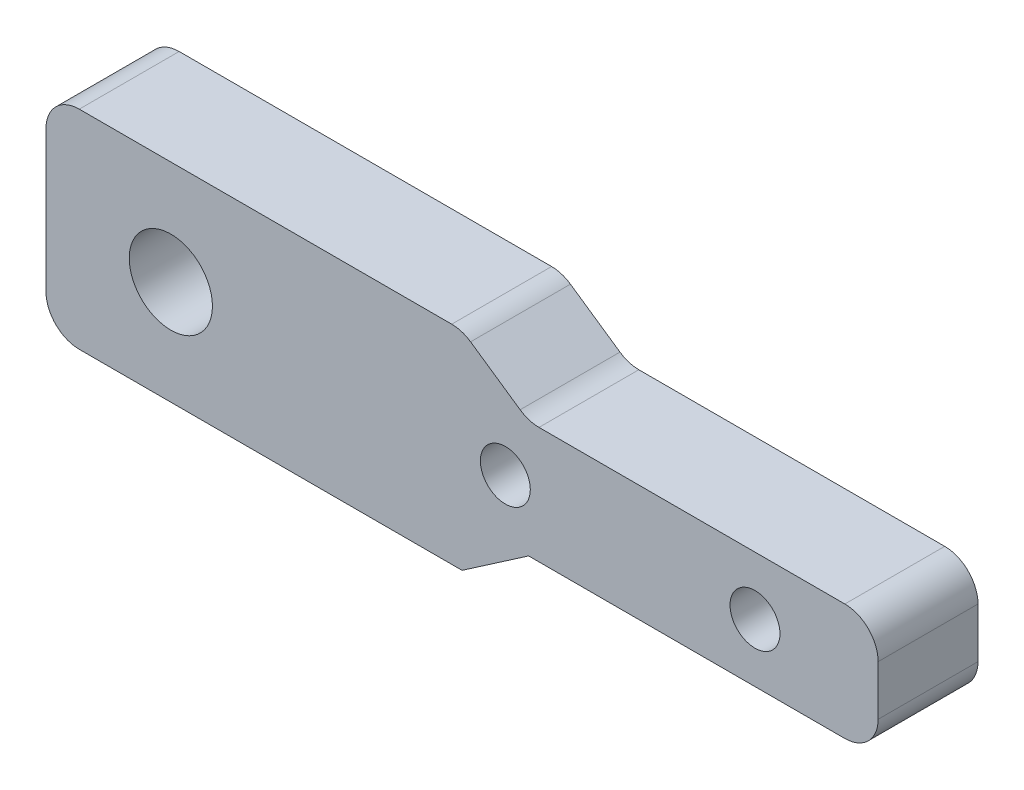
ISO-10303-21;
HEADER;
FILE_DESCRIPTION(('STEP AP214'),'2;1');
FILE_NAME('part.step','',(''),(''),'','','');
FILE_SCHEMA(('AUTOMOTIVE_DESIGN { 1 0 10303 214 1 1 1 1 }'));
ENDSEC;
DATA;
#1=APPLICATION_CONTEXT('core data for automotive mechanical design processes');
#2=APPLICATION_PROTOCOL_DEFINITION('international standard','automotive_design',2000,#1);
#3=PRODUCT_CONTEXT('',#1,'mechanical');
#4=PRODUCT('Part','Part','',(#3));
#5=PRODUCT_RELATED_PRODUCT_CATEGORY('part','',(#4));
#6=PRODUCT_DEFINITION_FORMATION('','',#4);
#7=PRODUCT_DEFINITION_CONTEXT('part definition',#1,'design');
#8=PRODUCT_DEFINITION('design','',#6,#7);
#9=PRODUCT_DEFINITION_SHAPE('','',#8);
#10=(LENGTH_UNIT() NAMED_UNIT(*) SI_UNIT(.MILLI.,.METRE.));
#11=(NAMED_UNIT(*) PLANE_ANGLE_UNIT() SI_UNIT($,.RADIAN.));
#12=(NAMED_UNIT(*) SI_UNIT($,.STERADIAN.) SOLID_ANGLE_UNIT());
#13=UNCERTAINTY_MEASURE_WITH_UNIT(LENGTH_MEASURE(1.E-05),#10,'distance_accuracy_value','');
#14=(GEOMETRIC_REPRESENTATION_CONTEXT(3) GLOBAL_UNCERTAINTY_ASSIGNED_CONTEXT((#13)) GLOBAL_UNIT_ASSIGNED_CONTEXT((#10,
#11,#12)) REPRESENTATION_CONTEXT('',''));
#15=CARTESIAN_POINT('',(0.,0.,0.));
#16=DIRECTION('',(0.,0.,1.));
#17=DIRECTION('',(1.,0.,0.));
#18=AXIS2_PLACEMENT_3D('',#15,#16,#17);
#19=CARTESIAN_POINT('',(-23.0608329047481,6.25,6.));
#20=DIRECTION('',(1.,0.,0.));
#21=DIRECTION('',(0.,0.,-1.));
#22=AXIS2_PLACEMENT_3D('',#19,#20,#21);
#23=PLANE('',#22);
#24=DIRECTION('',(0.,-1.,0.));
#25=VECTOR('',#24,1.);
#26=CARTESIAN_POINT('',(-23.0608329047481,6.25,0.));
#27=LINE('',#26,#25);
#28=CARTESIAN_POINT('',(-23.0608329047481,4.25,0.));
#29=VERTEX_POINT('',#28);
#30=CARTESIAN_POINT('',(-23.0608329047481,-4.25,0.));
#31=VERTEX_POINT('',#30);
#32=EDGE_CURVE('E176',#29,#31,#27,.T.);
#33=ORIENTED_EDGE('',*,*,#32,.T.);
#34=DIRECTION('',(0.,0.,-1.));
#35=VECTOR('',#34,1.);
#36=CARTESIAN_POINT('',(-23.0608329047481,-4.25,6.));
#37=LINE('',#36,#35);
#38=CARTESIAN_POINT('',(-23.0608329047481,-4.25,6.));
#39=VERTEX_POINT('',#38);
#40=EDGE_CURVE('E232',#31,#39,#37,.F.);
#41=ORIENTED_EDGE('',*,*,#40,.T.);
#42=DIRECTION('',(0.,-1.,0.));
#43=VECTOR('',#42,1.);
#44=CARTESIAN_POINT('',(-23.0608329047481,6.25,6.));
#45=LINE('',#44,#43);
#46=CARTESIAN_POINT('',(-23.0608329047481,4.25,6.));
#47=VERTEX_POINT('',#46);
#48=EDGE_CURVE('E146',#47,#39,#45,.T.);
#49=ORIENTED_EDGE('',*,*,#48,.F.);
#50=DIRECTION('',(0.,0.,-1.));
#51=VECTOR('',#50,1.);
#52=CARTESIAN_POINT('',(-23.0608329047481,4.25,6.));
#53=LINE('',#52,#51);
#54=EDGE_CURVE('E229',#47,#29,#53,.T.);
#55=ORIENTED_EDGE('',*,*,#54,.T.);
#56=EDGE_LOOP('',(#33,#41,#49,#55));
#57=FACE_BOUND('',#56,.T.);
#58=ADVANCED_FACE('F33',(#57),#23,.F.);
#59=CARTESIAN_POINT('',(-23.0608329047481,-6.25,6.));
#60=DIRECTION('',(0.,1.,0.));
#61=DIRECTION('',(0.,0.,1.));
#62=AXIS2_PLACEMENT_3D('',#59,#60,#61);
#63=PLANE('',#62);
#64=DIRECTION('',(1.,0.,0.));
#65=VECTOR('',#64,1.);
#66=CARTESIAN_POINT('',(-23.0608329047481,-6.25,6.));
#67=LINE('',#66,#65);
#68=CARTESIAN_POINT('',(-21.0608329047481,-6.25,6.));
#69=VERTEX_POINT('',#68);
#70=CARTESIAN_POINT('',(1.93916709525186,-6.25,6.));
#71=VERTEX_POINT('',#70);
#72=EDGE_CURVE('E133',#69,#71,#67,.T.);
#73=ORIENTED_EDGE('',*,*,#72,.F.);
#74=DIRECTION('',(0.,0.,-1.));
#75=VECTOR('',#74,1.);
#76=CARTESIAN_POINT('',(-21.0608329047481,-6.25,6.));
#77=LINE('',#76,#75);
#78=CARTESIAN_POINT('',(-21.0608329047481,-6.25,0.));
#79=VERTEX_POINT('',#78);
#80=EDGE_CURVE('E227',#69,#79,#77,.T.);
#81=ORIENTED_EDGE('',*,*,#80,.T.);
#82=DIRECTION('',(1.,0.,0.));
#83=VECTOR('',#82,1.);
#84=CARTESIAN_POINT('',(-23.0608329047481,-6.25,0.));
#85=LINE('',#84,#83);
#86=CARTESIAN_POINT('',(1.93916709525186,-6.25,0.));
#87=VERTEX_POINT('',#86);
#88=EDGE_CURVE('E152',#79,#87,#85,.T.);
#89=ORIENTED_EDGE('',*,*,#88,.T.);
#90=DIRECTION('',(0.,0.,-1.));
#91=VECTOR('',#90,1.);
#92=CARTESIAN_POINT('',(1.93916709525186,-6.25,6.));
#93=LINE('',#92,#91);
#94=EDGE_CURVE('E149',#71,#87,#93,.T.);
#95=ORIENTED_EDGE('',*,*,#94,.F.);
#96=EDGE_LOOP('',(#73,#81,#89,#95));
#97=FACE_BOUND('',#96,.T.);
#98=ADVANCED_FACE('F150',(#97),#63,.F.);
#99=CARTESIAN_POINT('',(5.93916709525186,-3.5,6.));
#100=DIRECTION('',(-0.566528822887065,0.824041924199368,0.));
#101=DIRECTION('',(-0.824041924199368,-0.566528822887065,0.));
#102=AXIS2_PLACEMENT_3D('',#99,#100,#101);
#103=PLANE('',#102);
#104=DIRECTION('',(0.824041924199368,0.566528822887065,0.));
#105=VECTOR('',#104,1.);
#106=CARTESIAN_POINT('',(5.93916709525186,-3.5,0.));
#107=LINE('',#106,#105);
#108=CARTESIAN_POINT('',(5.93916709525186,-3.5,0.));
#109=VERTEX_POINT('',#108);
#110=EDGE_CURVE('E181',#87,#109,#107,.T.);
#111=ORIENTED_EDGE('',*,*,#110,.T.);
#112=DIRECTION('',(0.,0.,-1.));
#113=VECTOR('',#112,1.);
#114=CARTESIAN_POINT('',(5.93916709525186,-3.5,6.));
#115=LINE('',#114,#113);
#116=CARTESIAN_POINT('',(5.93916709525186,-3.5,6.));
#117=VERTEX_POINT('',#116);
#118=EDGE_CURVE('E156',#117,#109,#115,.T.);
#119=ORIENTED_EDGE('',*,*,#118,.F.);
#120=DIRECTION('',(0.824041924199368,0.566528822887065,0.));
#121=VECTOR('',#120,1.);
#122=CARTESIAN_POINT('',(5.93916709525186,-3.5,6.));
#123=LINE('',#122,#121);
#124=EDGE_CURVE('E138',#71,#117,#123,.T.);
#125=ORIENTED_EDGE('',*,*,#124,.F.);
#126=ORIENTED_EDGE('',*,*,#94,.T.);
#127=EDGE_LOOP('',(#111,#119,#125,#126));
#128=FACE_BOUND('',#127,.T.);
#129=ADVANCED_FACE('F158',(#128),#103,.F.);
#130=CARTESIAN_POINT('',(5.93916709525186,-3.5,6.));
#131=DIRECTION('',(0.,1.,0.));
#132=DIRECTION('',(0.,0.,1.));
#133=AXIS2_PLACEMENT_3D('',#130,#131,#132);
#134=PLANE('',#133);
#135=DIRECTION('',(1.,0.,0.));
#136=VECTOR('',#135,1.);
#137=CARTESIAN_POINT('',(5.93916709525186,-3.5,0.));
#138=LINE('',#137,#136);
#139=CARTESIAN_POINT('',(24.9391670952519,-3.5,0.));
#140=VERTEX_POINT('',#139);
#141=EDGE_CURVE('E183',#109,#140,#138,.T.);
#142=ORIENTED_EDGE('',*,*,#141,.T.);
#143=DIRECTION('',(0.,0.,-1.));
#144=VECTOR('',#143,1.);
#145=CARTESIAN_POINT('',(24.9391670952519,-3.5,6.));
#146=LINE('',#145,#144);
#147=CARTESIAN_POINT('',(24.9391670952519,-3.5,6.));
#148=VERTEX_POINT('',#147);
#149=EDGE_CURVE('E212',#140,#148,#146,.F.);
#150=ORIENTED_EDGE('',*,*,#149,.T.);
#151=DIRECTION('',(1.,0.,0.));
#152=VECTOR('',#151,1.);
#153=CARTESIAN_POINT('',(5.93916709525186,-3.5,6.));
#154=LINE('',#153,#152);
#155=EDGE_CURVE('E161',#117,#148,#154,.T.);
#156=ORIENTED_EDGE('',*,*,#155,.F.);
#157=ORIENTED_EDGE('',*,*,#118,.T.);
#158=EDGE_LOOP('',(#142,#150,#156,#157));
#159=FACE_BOUND('',#158,.T.);
#160=ADVANCED_FACE('F422',(#159),#134,.F.);
#161=CARTESIAN_POINT('',(26.9391670952519,3.5,6.));
#162=DIRECTION('',(-1.,0.,0.));
#163=DIRECTION('',(0.,0.,1.));
#164=AXIS2_PLACEMENT_3D('',#161,#162,#163);
#165=PLANE('',#164);
#166=DIRECTION('',(0.,1.,0.));
#167=VECTOR('',#166,1.);
#168=CARTESIAN_POINT('',(26.9391670952519,3.5,6.));
#169=LINE('',#168,#167);
#170=CARTESIAN_POINT('',(26.9391670952519,-1.5,6.));
#171=VERTEX_POINT('',#170);
#172=CARTESIAN_POINT('',(26.9391670952519,1.5,6.));
#173=VERTEX_POINT('',#172);
#174=EDGE_CURVE('E163',#171,#173,#169,.T.);
#175=ORIENTED_EDGE('',*,*,#174,.F.);
#176=DIRECTION('',(0.,0.,-1.));
#177=VECTOR('',#176,1.);
#178=CARTESIAN_POINT('',(26.9391670952519,-1.5,6.));
#179=LINE('',#178,#177);
#180=CARTESIAN_POINT('',(26.9391670952519,-1.5,0.));
#181=VERTEX_POINT('',#180);
#182=EDGE_CURVE('E199',#171,#181,#179,.T.);
#183=ORIENTED_EDGE('',*,*,#182,.T.);
#184=DIRECTION('',(0.,1.,0.));
#185=VECTOR('',#184,1.);
#186=CARTESIAN_POINT('',(26.9391670952519,3.5,0.));
#187=LINE('',#186,#185);
#188=CARTESIAN_POINT('',(26.9391670952519,1.5,0.));
#189=VERTEX_POINT('',#188);
#190=EDGE_CURVE('E186',#181,#189,#187,.T.);
#191=ORIENTED_EDGE('',*,*,#190,.T.);
#192=DIRECTION('',(0.,0.,-1.));
#193=VECTOR('',#192,1.);
#194=CARTESIAN_POINT('',(26.9391670952519,1.5,6.));
#195=LINE('',#194,#193);
#196=EDGE_CURVE('E155',#189,#173,#195,.F.);
#197=ORIENTED_EDGE('',*,*,#196,.T.);
#198=EDGE_LOOP('',(#175,#183,#191,#197));
#199=FACE_BOUND('',#198,.T.);
#200=ADVANCED_FACE('F413',(#199),#165,.F.);
#201=CARTESIAN_POINT('',(5.93916709525186,3.5,6.));
#202=DIRECTION('',(0.,-1.,0.));
#203=DIRECTION('',(0.,0.,-1.));
#204=AXIS2_PLACEMENT_3D('',#201,#202,#203);
#205=PLANE('',#204);
#206=DIRECTION('',(-1.,0.,0.));
#207=VECTOR('',#206,1.);
#208=CARTESIAN_POINT('',(5.93916709525186,3.5,6.));
#209=LINE('',#208,#207);
#210=CARTESIAN_POINT('',(24.9391670952519,3.5,6.));
#211=VERTEX_POINT('',#210);
#212=CARTESIAN_POINT('',(6.56034670233324,3.5,6.));
#213=VERTEX_POINT('',#212);
#214=EDGE_CURVE('E169',#211,#213,#209,.T.);
#215=ORIENTED_EDGE('',*,*,#214,.F.);
#216=DIRECTION('',(0.,0.,-1.));
#217=VECTOR('',#216,1.);
#218=CARTESIAN_POINT('',(24.9391670952519,3.5,6.));
#219=LINE('',#218,#217);
#220=CARTESIAN_POINT('',(24.9391670952519,3.5,0.));
#221=VERTEX_POINT('',#220);
#222=EDGE_CURVE('E224',#211,#221,#219,.T.);
#223=ORIENTED_EDGE('',*,*,#222,.T.);
#224=DIRECTION('',(-1.,0.,0.));
#225=VECTOR('',#224,1.);
#226=CARTESIAN_POINT('',(5.93916709525186,3.5,0.));
#227=LINE('',#226,#225);
#228=CARTESIAN_POINT('',(6.56034670233324,3.5,0.));
#229=VERTEX_POINT('',#228);
#230=EDGE_CURVE('E189',#221,#229,#227,.T.);
#231=ORIENTED_EDGE('',*,*,#230,.T.);
#232=DIRECTION('',(0.,0.,-1.));
#233=VECTOR('',#232,1.);
#234=CARTESIAN_POINT('',(6.56034670233324,3.5,6.));
#235=LINE('',#234,#233);
#236=EDGE_CURVE('E222',#229,#213,#235,.F.);
#237=ORIENTED_EDGE('',*,*,#236,.T.);
#238=EDGE_LOOP('',(#215,#223,#231,#237));
#239=FACE_BOUND('',#238,.T.);
#240=ADVANCED_FACE('F252',(#239),#205,.F.);
#241=CARTESIAN_POINT('',(5.93916709525186,3.5,6.));
#242=DIRECTION('',(-0.566528822887065,-0.824041924199368,0.));
#243=DIRECTION('',(0.824041924199368,-0.566528822887065,0.));
#244=AXIS2_PLACEMENT_3D('',#241,#242,#243);
#245=PLANE('',#244);
#246=DIRECTION('',(-0.824041924199368,0.566528822887065,0.));
#247=VECTOR('',#246,1.);
#248=CARTESIAN_POINT('',(5.93916709525186,3.5,6.));
#249=LINE('',#248,#247);
#250=CARTESIAN_POINT('',(5.42728905655911,3.85191615160126,6.));
#251=VERTEX_POINT('',#250);
#252=CARTESIAN_POINT('',(2.4510451339446,5.89808384839874,6.));
#253=VERTEX_POINT('',#252);
#254=EDGE_CURVE('E172',#251,#253,#249,.T.);
#255=ORIENTED_EDGE('',*,*,#254,.F.);
#256=DIRECTION('',(0.,0.,-1.));
#257=VECTOR('',#256,1.);
#258=CARTESIAN_POINT('',(5.42728905655911,3.85191615160126,0.));
#259=LINE('',#258,#257);
#260=CARTESIAN_POINT('',(5.42728905655911,3.85191615160126,0.));
#261=VERTEX_POINT('',#260);
#262=EDGE_CURVE('E240',#251,#261,#259,.T.);
#263=ORIENTED_EDGE('',*,*,#262,.T.);
#264=DIRECTION('',(-0.824041924199368,0.566528822887065,0.));
#265=VECTOR('',#264,1.);
#266=CARTESIAN_POINT('',(5.93916709525186,3.5,0.));
#267=LINE('',#266,#265);
#268=CARTESIAN_POINT('',(2.4510451339446,5.89808384839874,0.));
#269=VERTEX_POINT('',#268);
#270=EDGE_CURVE('E192',#261,#269,#267,.T.);
#271=ORIENTED_EDGE('',*,*,#270,.T.);
#272=DIRECTION('',(0.,0.,-1.));
#273=VECTOR('',#272,1.);
#274=CARTESIAN_POINT('',(2.4510451339446,5.89808384839874,6.));
#275=LINE('',#274,#273);
#276=EDGE_CURVE('E238',#269,#253,#275,.F.);
#277=ORIENTED_EDGE('',*,*,#276,.T.);
#278=EDGE_LOOP('',(#255,#263,#271,#277));
#279=FACE_BOUND('',#278,.T.);
#280=ADVANCED_FACE('F258',(#279),#245,.F.);
#281=CARTESIAN_POINT('',(-23.0608329047481,6.25,6.));
#282=DIRECTION('',(0.,-1.,0.));
#283=DIRECTION('',(0.,0.,-1.));
#284=AXIS2_PLACEMENT_3D('',#281,#282,#283);
#285=PLANE('',#284);
#286=DIRECTION('',(-1.,0.,0.));
#287=VECTOR('',#286,1.);
#288=CARTESIAN_POINT('',(-23.0608329047481,6.25,0.));
#289=LINE('',#288,#287);
#290=CARTESIAN_POINT('',(1.31798748817047,6.25,0.));
#291=VERTEX_POINT('',#290);
#292=CARTESIAN_POINT('',(-21.0608329047481,6.25,0.));
#293=VERTEX_POINT('',#292);
#294=EDGE_CURVE('E195',#291,#293,#289,.T.);
#295=ORIENTED_EDGE('',*,*,#294,.T.);
#296=DIRECTION('',(0.,0.,-1.));
#297=VECTOR('',#296,1.);
#298=CARTESIAN_POINT('',(-21.0608329047481,6.25,6.));
#299=LINE('',#298,#297);
#300=CARTESIAN_POINT('',(-21.0608329047481,6.25,6.));
#301=VERTEX_POINT('',#300);
#302=EDGE_CURVE('E48',#293,#301,#299,.F.);
#303=ORIENTED_EDGE('',*,*,#302,.T.);
#304=DIRECTION('',(-1.,0.,0.));
#305=VECTOR('',#304,1.);
#306=CARTESIAN_POINT('',(-23.0608329047481,6.25,6.));
#307=LINE('',#306,#305);
#308=CARTESIAN_POINT('',(1.31798748817047,6.25,6.));
#309=VERTEX_POINT('',#308);
#310=EDGE_CURVE('E174',#309,#301,#307,.T.);
#311=ORIENTED_EDGE('',*,*,#310,.F.);
#312=DIRECTION('',(0.,0.,-1.));
#313=VECTOR('',#312,1.);
#314=CARTESIAN_POINT('',(1.31798748817047,6.25,6.));
#315=LINE('',#314,#313);
#316=EDGE_CURVE('E234',#309,#291,#315,.T.);
#317=ORIENTED_EDGE('',*,*,#316,.T.);
#318=EDGE_LOOP('',(#295,#303,#311,#317));
#319=FACE_BOUND('',#318,.T.);
#320=ADVANCED_FACE('F263',(#319),#285,.F.);
#321=CARTESIAN_POINT('',(0.,0.,6.));
#322=DIRECTION('',(0.,0.,1.));
#323=DIRECTION('',(1.,0.,0.));
#324=AXIS2_PLACEMENT_3D('',#321,#322,#323);
#325=PLANE('',#324);
#326=CARTESIAN_POINT('',(19.5391670952519,0.,6.));
#327=DIRECTION('',(0.,0.,1.));
#328=DIRECTION('',(1.,0.,0.));
#329=AXIS2_PLACEMENT_3D('',#326,#327,#328);
#330=CIRCLE('',#329,1.5);
#331=CARTESIAN_POINT('',(21.0391670952519,0.,6.));
#332=VERTEX_POINT('',#331);
#333=EDGE_CURVE('E285',#332,#332,#330,.T.);
#334=ORIENTED_EDGE('',*,*,#333,.F.);
#335=EDGE_LOOP('',(#334));
#336=FACE_BOUND('',#335,.T.);
#337=CARTESIAN_POINT('',(4.53916709525186,0.,6.));
#338=DIRECTION('',(0.,0.,1.));
#339=DIRECTION('',(1.,0.,0.));
#340=AXIS2_PLACEMENT_3D('',#337,#338,#339);
#341=CIRCLE('',#340,1.5);
#342=CARTESIAN_POINT('',(6.03916709525186,0.,6.));
#343=VERTEX_POINT('',#342);
#344=EDGE_CURVE('E279',#343,#343,#341,.T.);
#345=ORIENTED_EDGE('',*,*,#344,.F.);
#346=EDGE_LOOP('',(#345));
#347=FACE_BOUND('',#346,.T.);
#348=CARTESIAN_POINT('',(-15.5608329047481,0.,6.));
#349=DIRECTION('',(0.,0.,1.));
#350=DIRECTION('',(1.,0.,0.));
#351=AXIS2_PLACEMENT_3D('',#348,#349,#350);
#352=CIRCLE('',#351,2.5);
#353=CARTESIAN_POINT('',(-13.0608329047481,0.,6.));
#354=VERTEX_POINT('',#353);
#355=EDGE_CURVE('E273',#354,#354,#352,.T.);
#356=ORIENTED_EDGE('',*,*,#355,.F.);
#357=EDGE_LOOP('',(#356));
#358=FACE_BOUND('',#357,.T.);
#359=ORIENTED_EDGE('',*,*,#155,.T.);
#360=CARTESIAN_POINT('',(24.9391670952519,-1.5,6.));
#361=DIRECTION('',(0.,0.,1.));
#362=DIRECTION('',(1.,0.,0.));
#363=AXIS2_PLACEMENT_3D('',#360,#361,#362);
#364=CIRCLE('',#363,2.);
#365=EDGE_CURVE('E220',#148,#171,#364,.T.);
#366=ORIENTED_EDGE('',*,*,#365,.T.);
#367=ORIENTED_EDGE('',*,*,#174,.T.);
#368=CARTESIAN_POINT('',(24.9391670952519,1.5,6.));
#369=DIRECTION('',(0.,0.,1.));
#370=DIRECTION('',(1.,0.,0.));
#371=AXIS2_PLACEMENT_3D('',#368,#369,#370);
#372=CIRCLE('',#371,2.);
#373=EDGE_CURVE('E218',#173,#211,#372,.T.);
#374=ORIENTED_EDGE('',*,*,#373,.T.);
#375=ORIENTED_EDGE('',*,*,#214,.T.);
#376=CARTESIAN_POINT('',(6.56034670233324,5.5,6.));
#377=DIRECTION('',(0.,0.,1.));
#378=DIRECTION('',(1.,0.,0.));
#379=AXIS2_PLACEMENT_3D('',#376,#377,#378);
#380=CIRCLE('',#379,2.);
#381=EDGE_CURVE('E11',#213,#251,#380,.F.);
#382=ORIENTED_EDGE('',*,*,#381,.T.);
#383=ORIENTED_EDGE('',*,*,#254,.T.);
#384=CARTESIAN_POINT('',(1.31798748817047,4.25,6.));
#385=DIRECTION('',(0.,0.,1.));
#386=DIRECTION('',(1.,0.,0.));
#387=AXIS2_PLACEMENT_3D('',#384,#385,#386);
#388=CIRCLE('',#387,2.);
#389=EDGE_CURVE('E55',#253,#309,#388,.T.);
#390=ORIENTED_EDGE('',*,*,#389,.T.);
#391=ORIENTED_EDGE('',*,*,#310,.T.);
#392=CARTESIAN_POINT('',(-21.0608329047481,4.25,6.));
#393=DIRECTION('',(0.,0.,1.));
#394=DIRECTION('',(1.,0.,0.));
#395=AXIS2_PLACEMENT_3D('',#392,#393,#394);
#396=CIRCLE('',#395,2.);
#397=EDGE_CURVE('E215',#301,#47,#396,.T.);
#398=ORIENTED_EDGE('',*,*,#397,.T.);
#399=ORIENTED_EDGE('',*,*,#48,.T.);
#400=CARTESIAN_POINT('',(-21.0608329047481,-4.25,6.));
#401=DIRECTION('',(0.,0.,1.));
#402=DIRECTION('',(1.,0.,0.));
#403=AXIS2_PLACEMENT_3D('',#400,#401,#402);
#404=CIRCLE('',#403,2.);
#405=EDGE_CURVE('E142',#39,#69,#404,.T.);
#406=ORIENTED_EDGE('',*,*,#405,.T.);
#407=ORIENTED_EDGE('',*,*,#72,.T.);
#408=ORIENTED_EDGE('',*,*,#124,.T.);
#409=EDGE_LOOP('',(#359,#366,#367,#374,#375,#382,#383,#390,#391,#398,#399,#406,#407,#408));
#410=FACE_BOUND('',#409,.T.);
#411=ADVANCED_FACE('F136',(#336,#347,#358,#410),#325,.T.);
#412=CARTESIAN_POINT('',(0.,0.,0.));
#413=DIRECTION('',(0.,0.,1.));
#414=DIRECTION('',(1.,0.,0.));
#415=AXIS2_PLACEMENT_3D('',#412,#413,#414);
#416=PLANE('',#415);
#417=CARTESIAN_POINT('',(19.5391670952519,0.,0.));
#418=DIRECTION('',(0.,0.,1.));
#419=DIRECTION('',(1.,0.,0.));
#420=AXIS2_PLACEMENT_3D('',#417,#418,#419);
#421=CIRCLE('',#420,1.5);
#422=CARTESIAN_POINT('',(21.0391670952519,0.,0.));
#423=VERTEX_POINT('',#422);
#424=EDGE_CURVE('E282',#423,#423,#421,.T.);
#425=ORIENTED_EDGE('',*,*,#424,.T.);
#426=EDGE_LOOP('',(#425));
#427=FACE_BOUND('',#426,.T.);
#428=CARTESIAN_POINT('',(4.53916709525186,0.,0.));
#429=DIRECTION('',(0.,0.,1.));
#430=DIRECTION('',(1.,0.,0.));
#431=AXIS2_PLACEMENT_3D('',#428,#429,#430);
#432=CIRCLE('',#431,1.5);
#433=CARTESIAN_POINT('',(6.03916709525186,0.,0.));
#434=VERTEX_POINT('',#433);
#435=EDGE_CURVE('E276',#434,#434,#432,.T.);
#436=ORIENTED_EDGE('',*,*,#435,.T.);
#437=EDGE_LOOP('',(#436));
#438=FACE_BOUND('',#437,.T.);
#439=CARTESIAN_POINT('',(-15.5608329047481,0.,0.));
#440=DIRECTION('',(0.,0.,1.));
#441=DIRECTION('',(1.,0.,0.));
#442=AXIS2_PLACEMENT_3D('',#439,#440,#441);
#443=CIRCLE('',#442,2.5);
#444=CARTESIAN_POINT('',(-13.0608329047481,0.,0.));
#445=VERTEX_POINT('',#444);
#446=EDGE_CURVE('E179',#445,#445,#443,.T.);
#447=ORIENTED_EDGE('',*,*,#446,.T.);
#448=EDGE_LOOP('',(#447));
#449=FACE_BOUND('',#448,.T.);
#450=ORIENTED_EDGE('',*,*,#190,.F.);
#451=CARTESIAN_POINT('',(24.9391670952519,-1.5,0.));
#452=DIRECTION('',(0.,0.,1.));
#453=DIRECTION('',(1.,0.,0.));
#454=AXIS2_PLACEMENT_3D('',#451,#452,#453);
#455=CIRCLE('',#454,2.);
#456=EDGE_CURVE('E210',#181,#140,#455,.F.);
#457=ORIENTED_EDGE('',*,*,#456,.T.);
#458=ORIENTED_EDGE('',*,*,#141,.F.);
#459=ORIENTED_EDGE('',*,*,#110,.F.);
#460=ORIENTED_EDGE('',*,*,#88,.F.);
#461=CARTESIAN_POINT('',(-21.0608329047481,-4.25,0.));
#462=DIRECTION('',(0.,0.,1.));
#463=DIRECTION('',(1.,0.,0.));
#464=AXIS2_PLACEMENT_3D('',#461,#462,#463);
#465=CIRCLE('',#464,2.);
#466=EDGE_CURVE('E206',#79,#31,#465,.F.);
#467=ORIENTED_EDGE('',*,*,#466,.T.);
#468=ORIENTED_EDGE('',*,*,#32,.F.);
#469=CARTESIAN_POINT('',(-21.0608329047481,4.25,0.));
#470=DIRECTION('',(0.,0.,1.));
#471=DIRECTION('',(1.,0.,0.));
#472=AXIS2_PLACEMENT_3D('',#469,#470,#471);
#473=CIRCLE('',#472,2.);
#474=EDGE_CURVE('E204',#29,#293,#473,.F.);
#475=ORIENTED_EDGE('',*,*,#474,.T.);
#476=ORIENTED_EDGE('',*,*,#294,.F.);
#477=CARTESIAN_POINT('',(1.31798748817047,4.25,0.));
#478=DIRECTION('',(0.,0.,1.));
#479=DIRECTION('',(1.,0.,0.));
#480=AXIS2_PLACEMENT_3D('',#477,#478,#479);
#481=CIRCLE('',#480,2.);
#482=EDGE_CURVE('E202',#291,#269,#481,.F.);
#483=ORIENTED_EDGE('',*,*,#482,.T.);
#484=ORIENTED_EDGE('',*,*,#270,.F.);
#485=CARTESIAN_POINT('',(6.56034670233324,5.5,0.));
#486=DIRECTION('',(0.,0.,1.));
#487=DIRECTION('',(1.,0.,0.));
#488=AXIS2_PLACEMENT_3D('',#485,#486,#487);
#489=CIRCLE('',#488,2.);
#490=EDGE_CURVE('E41',#261,#229,#489,.T.);
#491=ORIENTED_EDGE('',*,*,#490,.T.);
#492=ORIENTED_EDGE('',*,*,#230,.F.);
#493=CARTESIAN_POINT('',(24.9391670952519,1.5,0.));
#494=DIRECTION('',(0.,0.,1.));
#495=DIRECTION('',(1.,0.,0.));
#496=AXIS2_PLACEMENT_3D('',#493,#494,#495);
#497=CIRCLE('',#496,2.);
#498=EDGE_CURVE('E208',#221,#189,#497,.F.);
#499=ORIENTED_EDGE('',*,*,#498,.T.);
#500=EDGE_LOOP('',(#450,#457,#458,#459,#460,#467,#468,#475,#476,#483,#484,#491,#492,#499));
#501=FACE_BOUND('',#500,.T.);
#502=ADVANCED_FACE('F246',(#427,#438,#449,#501),#416,.F.);
#503=CARTESIAN_POINT('',(-15.5608329047481,0.,0.));
#504=DIRECTION('',(0.,0.,1.));
#505=DIRECTION('',(1.,0.,0.));
#506=AXIS2_PLACEMENT_3D('',#503,#504,#505);
#507=CYLINDRICAL_SURFACE('',#506,2.5);
#508=ORIENTED_EDGE('',*,*,#446,.F.);
#509=EDGE_LOOP('',(#508));
#510=FACE_BOUND('',#509,.T.);
#511=ORIENTED_EDGE('',*,*,#355,.T.);
#512=EDGE_LOOP('',(#511));
#513=FACE_BOUND('',#512,.T.);
#514=ADVANCED_FACE('F308',(#510,#513),#507,.F.);
#515=CARTESIAN_POINT('',(4.53916709525186,0.,0.));
#516=DIRECTION('',(0.,0.,1.));
#517=DIRECTION('',(1.,0.,0.));
#518=AXIS2_PLACEMENT_3D('',#515,#516,#517);
#519=CYLINDRICAL_SURFACE('',#518,1.5);
#520=ORIENTED_EDGE('',*,*,#435,.F.);
#521=EDGE_LOOP('',(#520));
#522=FACE_BOUND('',#521,.T.);
#523=ORIENTED_EDGE('',*,*,#344,.T.);
#524=EDGE_LOOP('',(#523));
#525=FACE_BOUND('',#524,.T.);
#526=ADVANCED_FACE('F297',(#522,#525),#519,.F.);
#527=CARTESIAN_POINT('',(19.5391670952519,0.,0.));
#528=DIRECTION('',(0.,0.,1.));
#529=DIRECTION('',(1.,0.,0.));
#530=AXIS2_PLACEMENT_3D('',#527,#528,#529);
#531=CYLINDRICAL_SURFACE('',#530,1.5);
#532=ORIENTED_EDGE('',*,*,#424,.F.);
#533=EDGE_LOOP('',(#532));
#534=FACE_BOUND('',#533,.T.);
#535=ORIENTED_EDGE('',*,*,#333,.T.);
#536=EDGE_LOOP('',(#535));
#537=FACE_BOUND('',#536,.T.);
#538=ADVANCED_FACE('F293',(#534,#537),#531,.F.);
#539=CARTESIAN_POINT('',(24.9391670952519,-1.5,6.));
#540=DIRECTION('',(0.,0.,-1.));
#541=DIRECTION('',(-1.,0.,0.));
#542=AXIS2_PLACEMENT_3D('',#539,#540,#541);
#543=CYLINDRICAL_SURFACE('',#542,2.);
#544=ORIENTED_EDGE('',*,*,#365,.F.);
#545=ORIENTED_EDGE('',*,*,#149,.F.);
#546=ORIENTED_EDGE('',*,*,#456,.F.);
#547=ORIENTED_EDGE('',*,*,#182,.F.);
#548=EDGE_LOOP('',(#544,#545,#546,#547));
#549=FACE_BOUND('',#548,.T.);
#550=ADVANCED_FACE('F296',(#549),#543,.T.);
#551=CARTESIAN_POINT('',(24.9391670952519,1.5,6.));
#552=DIRECTION('',(0.,0.,-1.));
#553=DIRECTION('',(-1.,0.,0.));
#554=AXIS2_PLACEMENT_3D('',#551,#552,#553);
#555=CYLINDRICAL_SURFACE('',#554,2.);
#556=ORIENTED_EDGE('',*,*,#373,.F.);
#557=ORIENTED_EDGE('',*,*,#196,.F.);
#558=ORIENTED_EDGE('',*,*,#498,.F.);
#559=ORIENTED_EDGE('',*,*,#222,.F.);
#560=EDGE_LOOP('',(#556,#557,#558,#559));
#561=FACE_BOUND('',#560,.T.);
#562=ADVANCED_FACE('F330',(#561),#555,.T.);
#563=CARTESIAN_POINT('',(-21.0608329047481,-4.25,6.));
#564=DIRECTION('',(0.,0.,-1.));
#565=DIRECTION('',(-1.,0.,0.));
#566=AXIS2_PLACEMENT_3D('',#563,#564,#565);
#567=CYLINDRICAL_SURFACE('',#566,2.);
#568=ORIENTED_EDGE('',*,*,#405,.F.);
#569=ORIENTED_EDGE('',*,*,#40,.F.);
#570=ORIENTED_EDGE('',*,*,#466,.F.);
#571=ORIENTED_EDGE('',*,*,#80,.F.);
#572=EDGE_LOOP('',(#568,#569,#570,#571));
#573=FACE_BOUND('',#572,.T.);
#574=ADVANCED_FACE('F334',(#573),#567,.T.);
#575=CARTESIAN_POINT('',(-21.0608329047481,4.25,6.));
#576=DIRECTION('',(0.,0.,-1.));
#577=DIRECTION('',(-1.,0.,0.));
#578=AXIS2_PLACEMENT_3D('',#575,#576,#577);
#579=CYLINDRICAL_SURFACE('',#578,2.);
#580=ORIENTED_EDGE('',*,*,#397,.F.);
#581=ORIENTED_EDGE('',*,*,#302,.F.);
#582=ORIENTED_EDGE('',*,*,#474,.F.);
#583=ORIENTED_EDGE('',*,*,#54,.F.);
#584=EDGE_LOOP('',(#580,#581,#582,#583));
#585=FACE_BOUND('',#584,.T.);
#586=ADVANCED_FACE('F268',(#585),#579,.T.);
#587=CARTESIAN_POINT('',(6.56034670233324,5.5,6.));
#588=DIRECTION('',(0.,0.,1.));
#589=DIRECTION('',(1.,0.,0.));
#590=AXIS2_PLACEMENT_3D('',#587,#588,#589);
#591=CYLINDRICAL_SURFACE('',#590,2.);
#592=ORIENTED_EDGE('',*,*,#381,.F.);
#593=ORIENTED_EDGE('',*,*,#236,.F.);
#594=ORIENTED_EDGE('',*,*,#490,.F.);
#595=ORIENTED_EDGE('',*,*,#262,.F.);
#596=EDGE_LOOP('',(#592,#593,#594,#595));
#597=FACE_BOUND('',#596,.T.);
#598=ADVANCED_FACE('F255',(#597),#591,.F.);
#599=CARTESIAN_POINT('',(1.31798748817047,4.25,6.));
#600=DIRECTION('',(0.,0.,-1.));
#601=DIRECTION('',(-1.,0.,0.));
#602=AXIS2_PLACEMENT_3D('',#599,#600,#601);
#603=CYLINDRICAL_SURFACE('',#602,2.);
#604=ORIENTED_EDGE('',*,*,#389,.F.);
#605=ORIENTED_EDGE('',*,*,#276,.F.);
#606=ORIENTED_EDGE('',*,*,#482,.F.);
#607=ORIENTED_EDGE('',*,*,#316,.F.);
#608=EDGE_LOOP('',(#604,#605,#606,#607));
#609=FACE_BOUND('',#608,.T.);
#610=ADVANCED_FACE('F35',(#609),#603,.T.);
#611=CLOSED_SHELL('',(#58,#98,#129,#160,#200,#240,#280,#320,#411,#502,#514,#526,#538,#550,#562,
#574,#586,#598,#610));
#612=MANIFOLD_SOLID_BREP('B2',#611);
#613=ADVANCED_BREP_SHAPE_REPRESENTATION('',(#18,#612),#14);
#614=SHAPE_DEFINITION_REPRESENTATION(#9,#613);
ENDSEC;
END-ISO-10303-21;
